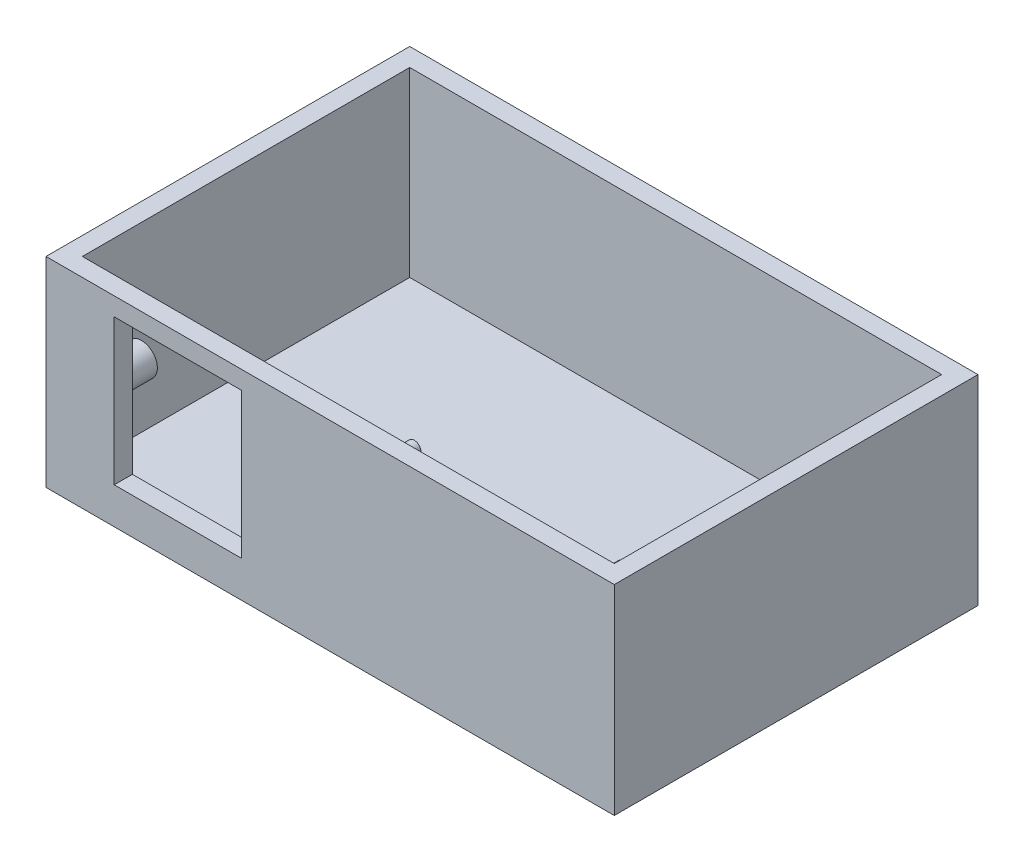
ISO-10303-21;
HEADER;
FILE_DESCRIPTION(('STEP AP214'),'2;1');
FILE_NAME('part.step','',(''),(''),'','','');
FILE_SCHEMA(('AUTOMOTIVE_DESIGN { 1 0 10303 214 1 1 1 1 }'));
ENDSEC;
DATA;
#1=APPLICATION_CONTEXT('core data for automotive mechanical design processes');
#2=APPLICATION_PROTOCOL_DEFINITION('international standard','automotive_design',2000,#1);
#3=PRODUCT_CONTEXT('',#1,'mechanical');
#4=PRODUCT('Part','Part','',(#3));
#5=PRODUCT_RELATED_PRODUCT_CATEGORY('part','',(#4));
#6=PRODUCT_DEFINITION_FORMATION('','',#4);
#7=PRODUCT_DEFINITION_CONTEXT('part definition',#1,'design');
#8=PRODUCT_DEFINITION('design','',#6,#7);
#9=PRODUCT_DEFINITION_SHAPE('','',#8);
#10=(LENGTH_UNIT() NAMED_UNIT(*) SI_UNIT(.MILLI.,.METRE.));
#11=(NAMED_UNIT(*) PLANE_ANGLE_UNIT() SI_UNIT($,.RADIAN.));
#12=(NAMED_UNIT(*) SI_UNIT($,.STERADIAN.) SOLID_ANGLE_UNIT());
#13=UNCERTAINTY_MEASURE_WITH_UNIT(LENGTH_MEASURE(1.E-05),#10,'distance_accuracy_value','');
#14=(GEOMETRIC_REPRESENTATION_CONTEXT(3) GLOBAL_UNCERTAINTY_ASSIGNED_CONTEXT((#13)) GLOBAL_UNIT_ASSIGNED_CONTEXT((#10,
#11,#12)) REPRESENTATION_CONTEXT('',''));
#15=CARTESIAN_POINT('',(0.,0.,0.));
#16=DIRECTION('',(0.,0.,1.));
#17=DIRECTION('',(1.,0.,0.));
#18=AXIS2_PLACEMENT_3D('',#15,#16,#17);
#19=CARTESIAN_POINT('',(0.,4.,0.));
#20=DIRECTION('',(1.,0.,0.));
#21=DIRECTION('',(0.,0.,-1.));
#22=AXIS2_PLACEMENT_3D('',#19,#20,#21);
#23=PLANE('',#22);
#24=DIRECTION('',(0.,0.,1.));
#25=VECTOR('',#24,1.);
#26=CARTESIAN_POINT('',(0.,0.,0.));
#27=LINE('',#26,#25);
#28=CARTESIAN_POINT('',(0.,0.,-80.));
#29=VERTEX_POINT('',#28);
#30=CARTESIAN_POINT('',(0.,0.,0.));
#31=VERTEX_POINT('',#30);
#32=EDGE_CURVE('E288',#29,#31,#27,.T.);
#33=ORIENTED_EDGE('',*,*,#32,.T.);
#34=DIRECTION('',(0.,-1.,0.));
#35=VECTOR('',#34,1.);
#36=CARTESIAN_POINT('',(0.,4.,0.));
#37=LINE('',#36,#35);
#38=CARTESIAN_POINT('',(0.,44.,0.));
#39=VERTEX_POINT('',#38);
#40=EDGE_CURVE('E306',#39,#31,#37,.T.);
#41=ORIENTED_EDGE('',*,*,#40,.F.);
#42=DIRECTION('',(0.,0.,1.));
#43=VECTOR('',#42,1.);
#44=CARTESIAN_POINT('',(0.,44.,-80.));
#45=LINE('',#44,#43);
#46=CARTESIAN_POINT('',(0.,44.,-80.));
#47=VERTEX_POINT('',#46);
#48=EDGE_CURVE('E276',#47,#39,#45,.T.);
#49=ORIENTED_EDGE('',*,*,#48,.F.);
#50=DIRECTION('',(0.,-1.,0.));
#51=VECTOR('',#50,1.);
#52=CARTESIAN_POINT('',(0.,4.,-80.));
#53=LINE('',#52,#51);
#54=EDGE_CURVE('E297',#47,#29,#53,.T.);
#55=ORIENTED_EDGE('',*,*,#54,.T.);
#56=EDGE_LOOP('',(#33,#41,#49,#55));
#57=FACE_BOUND('',#56,.T.);
#58=ADVANCED_FACE('F45',(#57),#23,.F.);
#59=CARTESIAN_POINT('',(0.,4.,0.));
#60=DIRECTION('',(0.,0.,-1.));
#61=DIRECTION('',(-1.,0.,0.));
#62=AXIS2_PLACEMENT_3D('',#59,#60,#61);
#63=PLANE('',#62);
#64=DIRECTION('',(1.,0.,0.));
#65=VECTOR('',#64,1.);
#66=CARTESIAN_POINT('',(15.,7.99999999999999,0.));
#67=LINE('',#66,#65);
#68=CARTESIAN_POINT('',(15.,7.99999999999999,0.));
#69=VERTEX_POINT('',#68);
#70=CARTESIAN_POINT('',(43.,7.99999999999999,0.));
#71=VERTEX_POINT('',#70);
#72=EDGE_CURVE('E231',#69,#71,#67,.T.);
#73=ORIENTED_EDGE('',*,*,#72,.F.);
#74=DIRECTION('',(0.,-1.,0.));
#75=VECTOR('',#74,1.);
#76=CARTESIAN_POINT('',(15.,7.99999999999999,0.));
#77=LINE('',#76,#75);
#78=CARTESIAN_POINT('',(15.,40.,0.));
#79=VERTEX_POINT('',#78);
#80=EDGE_CURVE('E59',#79,#69,#77,.T.);
#81=ORIENTED_EDGE('',*,*,#80,.F.);
#82=DIRECTION('',(-1.,0.,0.));
#83=VECTOR('',#82,1.);
#84=CARTESIAN_POINT('',(15.,40.,0.));
#85=LINE('',#84,#83);
#86=CARTESIAN_POINT('',(43.,40.,0.));
#87=VERTEX_POINT('',#86);
#88=EDGE_CURVE('E236',#87,#79,#85,.T.);
#89=ORIENTED_EDGE('',*,*,#88,.F.);
#90=DIRECTION('',(0.,1.,0.));
#91=VECTOR('',#90,1.);
#92=CARTESIAN_POINT('',(43.,7.99999999999999,0.));
#93=LINE('',#92,#91);
#94=EDGE_CURVE('E233',#71,#87,#93,.T.);
#95=ORIENTED_EDGE('',*,*,#94,.F.);
#96=EDGE_LOOP('',(#73,#81,#89,#95));
#97=FACE_BOUND('',#96,.T.);
#98=DIRECTION('',(1.,0.,0.));
#99=VECTOR('',#98,1.);
#100=CARTESIAN_POINT('',(0.,0.,0.));
#101=LINE('',#100,#99);
#102=CARTESIAN_POINT('',(125.,0.,0.));
#103=VERTEX_POINT('',#102);
#104=EDGE_CURVE('E291',#31,#103,#101,.T.);
#105=ORIENTED_EDGE('',*,*,#104,.T.);
#106=DIRECTION('',(0.,-1.,0.));
#107=VECTOR('',#106,1.);
#108=CARTESIAN_POINT('',(125.,4.,0.));
#109=LINE('',#108,#107);
#110=CARTESIAN_POINT('',(125.,44.,0.));
#111=VERTEX_POINT('',#110);
#112=EDGE_CURVE('E303',#111,#103,#109,.T.);
#113=ORIENTED_EDGE('',*,*,#112,.F.);
#114=DIRECTION('',(1.,0.,0.));
#115=VECTOR('',#114,1.);
#116=CARTESIAN_POINT('',(0.,44.,0.));
#117=LINE('',#116,#115);
#118=EDGE_CURVE('E279',#39,#111,#117,.T.);
#119=ORIENTED_EDGE('',*,*,#118,.F.);
#120=ORIENTED_EDGE('',*,*,#40,.T.);
#121=EDGE_LOOP('',(#105,#113,#119,#120));
#122=FACE_BOUND('',#121,.T.);
#123=ADVANCED_FACE('F331',(#97,#122),#63,.F.);
#124=CARTESIAN_POINT('',(125.,4.,0.));
#125=DIRECTION('',(-1.,0.,0.));
#126=DIRECTION('',(0.,0.,1.));
#127=AXIS2_PLACEMENT_3D('',#124,#125,#126);
#128=PLANE('',#127);
#129=DIRECTION('',(0.,0.,-1.));
#130=VECTOR('',#129,1.);
#131=CARTESIAN_POINT('',(125.,0.,0.));
#132=LINE('',#131,#130);
#133=CARTESIAN_POINT('',(125.,0.,-80.));
#134=VERTEX_POINT('',#133);
#135=EDGE_CURVE('E293',#103,#134,#132,.T.);
#136=ORIENTED_EDGE('',*,*,#135,.T.);
#137=DIRECTION('',(0.,-1.,0.));
#138=VECTOR('',#137,1.);
#139=CARTESIAN_POINT('',(125.,4.,-80.));
#140=LINE('',#139,#138);
#141=CARTESIAN_POINT('',(125.,44.,-80.));
#142=VERTEX_POINT('',#141);
#143=EDGE_CURVE('E300',#142,#134,#140,.T.);
#144=ORIENTED_EDGE('',*,*,#143,.F.);
#145=DIRECTION('',(0.,0.,-1.));
#146=VECTOR('',#145,1.);
#147=CARTESIAN_POINT('',(125.,44.,-80.));
#148=LINE('',#147,#146);
#149=EDGE_CURVE('E282',#111,#142,#148,.T.);
#150=ORIENTED_EDGE('',*,*,#149,.F.);
#151=ORIENTED_EDGE('',*,*,#112,.T.);
#152=EDGE_LOOP('',(#136,#144,#150,#151));
#153=FACE_BOUND('',#152,.T.);
#154=ADVANCED_FACE('F334',(#153),#128,.F.);
#155=CARTESIAN_POINT('',(0.,4.,-80.));
#156=DIRECTION('',(0.,0.,1.));
#157=DIRECTION('',(1.,0.,0.));
#158=AXIS2_PLACEMENT_3D('',#155,#156,#157);
#159=PLANE('',#158);
#160=DIRECTION('',(-1.,0.,0.));
#161=VECTOR('',#160,1.);
#162=CARTESIAN_POINT('',(0.,0.,-80.));
#163=LINE('',#162,#161);
#164=EDGE_CURVE('E295',#134,#29,#163,.T.);
#165=ORIENTED_EDGE('',*,*,#164,.T.);
#166=ORIENTED_EDGE('',*,*,#54,.F.);
#167=DIRECTION('',(-1.,0.,0.));
#168=VECTOR('',#167,1.);
#169=CARTESIAN_POINT('',(0.,44.,-80.));
#170=LINE('',#169,#168);
#171=EDGE_CURVE('E285',#142,#47,#170,.T.);
#172=ORIENTED_EDGE('',*,*,#171,.F.);
#173=ORIENTED_EDGE('',*,*,#143,.T.);
#174=EDGE_LOOP('',(#165,#166,#172,#173));
#175=FACE_BOUND('',#174,.T.);
#176=ADVANCED_FACE('F344',(#175),#159,.F.);
#177=CARTESIAN_POINT('',(0.,0.,0.));
#178=DIRECTION('',(0.,-1.,0.));
#179=DIRECTION('',(0.,0.,-1.));
#180=AXIS2_PLACEMENT_3D('',#177,#178,#179);
#181=PLANE('',#180);
#182=ORIENTED_EDGE('',*,*,#32,.F.);
#183=ORIENTED_EDGE('',*,*,#164,.F.);
#184=ORIENTED_EDGE('',*,*,#135,.F.);
#185=ORIENTED_EDGE('',*,*,#104,.F.);
#186=EDGE_LOOP('',(#182,#183,#184,#185));
#187=FACE_BOUND('',#186,.T.);
#188=ADVANCED_FACE('F342',(#187),#181,.T.);
#189=CARTESIAN_POINT('',(0.,44.,0.));
#190=DIRECTION('',(0.,1.,0.));
#191=DIRECTION('',(0.,0.,1.));
#192=AXIS2_PLACEMENT_3D('',#189,#190,#191);
#193=PLANE('',#192);
#194=ORIENTED_EDGE('',*,*,#48,.T.);
#195=ORIENTED_EDGE('',*,*,#118,.T.);
#196=ORIENTED_EDGE('',*,*,#149,.T.);
#197=ORIENTED_EDGE('',*,*,#171,.T.);
#198=EDGE_LOOP('',(#194,#195,#196,#197));
#199=FACE_BOUND('',#198,.T.);
#200=DIRECTION('',(1.,0.,0.));
#201=VECTOR('',#200,1.);
#202=CARTESIAN_POINT('',(4.,44.,-4.));
#203=LINE('',#202,#201);
#204=CARTESIAN_POINT('',(4.,44.,-4.));
#205=VERTEX_POINT('',#204);
#206=CARTESIAN_POINT('',(121.,44.,-4.));
#207=VERTEX_POINT('',#206);
#208=EDGE_CURVE('E249',#205,#207,#203,.T.);
#209=ORIENTED_EDGE('',*,*,#208,.F.);
#210=DIRECTION('',(0.,0.,1.));
#211=VECTOR('',#210,1.);
#212=CARTESIAN_POINT('',(4.,44.,-76.));
#213=LINE('',#212,#211);
#214=CARTESIAN_POINT('',(4.,44.,-76.));
#215=VERTEX_POINT('',#214);
#216=EDGE_CURVE('E247',#215,#205,#213,.T.);
#217=ORIENTED_EDGE('',*,*,#216,.F.);
#218=DIRECTION('',(-1.,0.,0.));
#219=VECTOR('',#218,1.);
#220=CARTESIAN_POINT('',(4.,44.,-76.));
#221=LINE('',#220,#219);
#222=CARTESIAN_POINT('',(121.,44.,-76.));
#223=VERTEX_POINT('',#222);
#224=EDGE_CURVE('E255',#223,#215,#221,.T.);
#225=ORIENTED_EDGE('',*,*,#224,.F.);
#226=DIRECTION('',(0.,0.,-1.));
#227=VECTOR('',#226,1.);
#228=CARTESIAN_POINT('',(121.,44.,-76.));
#229=LINE('',#228,#227);
#230=EDGE_CURVE('E252',#207,#223,#229,.T.);
#231=ORIENTED_EDGE('',*,*,#230,.F.);
#232=EDGE_LOOP('',(#209,#217,#225,#231));
#233=FACE_BOUND('',#232,.T.);
#234=ADVANCED_FACE('F349',(#199,#233),#193,.T.);
#235=CARTESIAN_POINT('',(4.,44.,-76.));
#236=DIRECTION('',(1.,0.,0.));
#237=DIRECTION('',(0.,0.,-1.));
#238=AXIS2_PLACEMENT_3D('',#235,#236,#237);
#239=PLANE('',#238);
#240=DIRECTION('',(0.,0.,1.));
#241=VECTOR('',#240,1.);
#242=CARTESIAN_POINT('',(4.,4.,-76.));
#243=LINE('',#242,#241);
#244=CARTESIAN_POINT('',(4.,4.,-76.));
#245=VERTEX_POINT('',#244);
#246=CARTESIAN_POINT('',(4.,4.,-4.));
#247=VERTEX_POINT('',#246);
#248=EDGE_CURVE('E242',#245,#247,#243,.T.);
#249=ORIENTED_EDGE('',*,*,#248,.F.);
#250=DIRECTION('',(0.,-1.,0.));
#251=VECTOR('',#250,1.);
#252=CARTESIAN_POINT('',(4.,44.,-76.));
#253=LINE('',#252,#251);
#254=EDGE_CURVE('E257',#215,#245,#253,.T.);
#255=ORIENTED_EDGE('',*,*,#254,.F.);
#256=ORIENTED_EDGE('',*,*,#216,.T.);
#257=DIRECTION('',(0.,-1.,0.));
#258=VECTOR('',#257,1.);
#259=CARTESIAN_POINT('',(4.,44.,-4.));
#260=LINE('',#259,#258);
#261=EDGE_CURVE('E273',#205,#247,#260,.T.);
#262=ORIENTED_EDGE('',*,*,#261,.T.);
#263=EDGE_LOOP('',(#249,#255,#256,#262));
#264=FACE_BOUND('',#263,.T.);
#265=ADVANCED_FACE('F352',(#264),#239,.T.);
#266=CARTESIAN_POINT('',(4.,44.,-4.));
#267=DIRECTION('',(0.,0.,-1.));
#268=DIRECTION('',(-1.,0.,0.));
#269=AXIS2_PLACEMENT_3D('',#266,#267,#268);
#270=PLANE('',#269);
#271=CARTESIAN_POINT('',(70.,14.,-4.));
#272=DIRECTION('',(0.,0.,-1.));
#273=DIRECTION('',(-1.,0.,0.));
#274=AXIS2_PLACEMENT_3D('',#271,#272,#273);
#275=CIRCLE('',#274,1.5);
#276=CARTESIAN_POINT('',(68.5,14.,-4.));
#277=VERTEX_POINT('',#276);
#278=EDGE_CURVE('E195',#277,#277,#275,.T.);
#279=ORIENTED_EDGE('',*,*,#278,.F.);
#280=EDGE_LOOP('',(#279));
#281=FACE_BOUND('',#280,.T.);
#282=CARTESIAN_POINT('',(116.,13.5,-4.));
#283=DIRECTION('',(0.,0.,-1.));
#284=DIRECTION('',(-1.,0.,0.));
#285=AXIS2_PLACEMENT_3D('',#282,#283,#284);
#286=CIRCLE('',#285,1.5);
#287=CARTESIAN_POINT('',(114.5,13.5,-4.));
#288=VERTEX_POINT('',#287);
#289=EDGE_CURVE('E201',#288,#288,#286,.T.);
#290=ORIENTED_EDGE('',*,*,#289,.F.);
#291=EDGE_LOOP('',(#290));
#292=FACE_BOUND('',#291,.T.);
#293=CARTESIAN_POINT('',(70.,37.,-4.));
#294=DIRECTION('',(0.,0.,-1.));
#295=DIRECTION('',(-1.,0.,0.));
#296=AXIS2_PLACEMENT_3D('',#293,#294,#295);
#297=CIRCLE('',#296,1.5);
#298=CARTESIAN_POINT('',(68.5,37.,-4.));
#299=VERTEX_POINT('',#298);
#300=EDGE_CURVE('E207',#299,#299,#297,.T.);
#301=ORIENTED_EDGE('',*,*,#300,.F.);
#302=EDGE_LOOP('',(#301));
#303=FACE_BOUND('',#302,.T.);
#304=CARTESIAN_POINT('',(116.,37.,-4.));
#305=DIRECTION('',(0.,0.,-1.));
#306=DIRECTION('',(-1.,0.,0.));
#307=AXIS2_PLACEMENT_3D('',#304,#305,#306);
#308=CIRCLE('',#307,1.5);
#309=CARTESIAN_POINT('',(114.5,37.,-4.));
#310=VERTEX_POINT('',#309);
#311=EDGE_CURVE('E213',#310,#310,#308,.T.);
#312=ORIENTED_EDGE('',*,*,#311,.F.);
#313=EDGE_LOOP('',(#312));
#314=FACE_BOUND('',#313,.T.);
#315=CARTESIAN_POINT('',(10.,24.,-4.));
#316=DIRECTION('',(0.,0.,-1.));
#317=DIRECTION('',(-1.,0.,0.));
#318=AXIS2_PLACEMENT_3D('',#315,#316,#317);
#319=CIRCLE('',#318,3.5);
#320=CARTESIAN_POINT('',(6.5,24.,-4.));
#321=VERTEX_POINT('',#320);
#322=EDGE_CURVE('E219',#321,#321,#319,.T.);
#323=ORIENTED_EDGE('',*,*,#322,.F.);
#324=EDGE_LOOP('',(#323));
#325=FACE_BOUND('',#324,.T.);
#326=CARTESIAN_POINT('',(48.,24.,-4.));
#327=DIRECTION('',(0.,0.,-1.));
#328=DIRECTION('',(-1.,0.,0.));
#329=AXIS2_PLACEMENT_3D('',#326,#327,#328);
#330=CIRCLE('',#329,3.5);
#331=CARTESIAN_POINT('',(44.5,24.,-4.));
#332=VERTEX_POINT('',#331);
#333=EDGE_CURVE('E222',#332,#332,#330,.T.);
#334=ORIENTED_EDGE('',*,*,#333,.F.);
#335=EDGE_LOOP('',(#334));
#336=FACE_BOUND('',#335,.T.);
#337=DIRECTION('',(0.,1.,0.));
#338=VECTOR('',#337,1.);
#339=CARTESIAN_POINT('',(15.,44.,-4.));
#340=LINE('',#339,#338);
#341=CARTESIAN_POINT('',(15.,7.99999999999999,-4.));
#342=VERTEX_POINT('',#341);
#343=CARTESIAN_POINT('',(15.,40.,-4.));
#344=VERTEX_POINT('',#343);
#345=EDGE_CURVE('E11',#342,#344,#340,.T.);
#346=ORIENTED_EDGE('',*,*,#345,.F.);
#347=DIRECTION('',(-1.,0.,0.));
#348=VECTOR('',#347,1.);
#349=CARTESIAN_POINT('',(4.,7.99999999999999,-4.));
#350=LINE('',#349,#348);
#351=CARTESIAN_POINT('',(43.,7.99999999999999,-4.));
#352=VERTEX_POINT('',#351);
#353=EDGE_CURVE('E309',#352,#342,#350,.T.);
#354=ORIENTED_EDGE('',*,*,#353,.F.);
#355=DIRECTION('',(0.,-1.,0.));
#356=VECTOR('',#355,1.);
#357=CARTESIAN_POINT('',(43.,44.,-4.));
#358=LINE('',#357,#356);
#359=CARTESIAN_POINT('',(43.,40.,-4.));
#360=VERTEX_POINT('',#359);
#361=EDGE_CURVE('E311',#360,#352,#358,.T.);
#362=ORIENTED_EDGE('',*,*,#361,.F.);
#363=DIRECTION('',(1.,0.,0.));
#364=VECTOR('',#363,1.);
#365=CARTESIAN_POINT('',(4.,40.,-4.));
#366=LINE('',#365,#364);
#367=EDGE_CURVE('E52',#344,#360,#366,.T.);
#368=ORIENTED_EDGE('',*,*,#367,.F.);
#369=EDGE_LOOP('',(#346,#354,#362,#368));
#370=FACE_BOUND('',#369,.T.);
#371=DIRECTION('',(1.,0.,0.));
#372=VECTOR('',#371,1.);
#373=CARTESIAN_POINT('',(4.,4.,-4.));
#374=LINE('',#373,#372);
#375=CARTESIAN_POINT('',(121.,4.,-4.));
#376=VERTEX_POINT('',#375);
#377=EDGE_CURVE('E260',#247,#376,#374,.T.);
#378=ORIENTED_EDGE('',*,*,#377,.F.);
#379=ORIENTED_EDGE('',*,*,#261,.F.);
#380=ORIENTED_EDGE('',*,*,#208,.T.);
#381=DIRECTION('',(0.,-1.,0.));
#382=VECTOR('',#381,1.);
#383=CARTESIAN_POINT('',(121.,44.,-4.));
#384=LINE('',#383,#382);
#385=EDGE_CURVE('E271',#207,#376,#384,.T.);
#386=ORIENTED_EDGE('',*,*,#385,.T.);
#387=EDGE_LOOP('',(#378,#379,#380,#386));
#388=FACE_BOUND('',#387,.T.);
#389=ADVANCED_FACE('F325',(#281,#292,#303,#314,#325,#336,#370,#388),#270,.T.);
#390=CARTESIAN_POINT('',(121.,44.,-76.));
#391=DIRECTION('',(-1.,0.,0.));
#392=DIRECTION('',(0.,0.,1.));
#393=AXIS2_PLACEMENT_3D('',#390,#391,#392);
#394=PLANE('',#393);
#395=DIRECTION('',(0.,0.,-1.));
#396=VECTOR('',#395,1.);
#397=CARTESIAN_POINT('',(121.,4.,-76.));
#398=LINE('',#397,#396);
#399=CARTESIAN_POINT('',(121.,4.,-76.));
#400=VERTEX_POINT('',#399);
#401=EDGE_CURVE('E263',#376,#400,#398,.T.);
#402=ORIENTED_EDGE('',*,*,#401,.F.);
#403=ORIENTED_EDGE('',*,*,#385,.F.);
#404=ORIENTED_EDGE('',*,*,#230,.T.);
#405=DIRECTION('',(0.,-1.,0.));
#406=VECTOR('',#405,1.);
#407=CARTESIAN_POINT('',(121.,44.,-76.));
#408=LINE('',#407,#406);
#409=EDGE_CURVE('E269',#223,#400,#408,.T.);
#410=ORIENTED_EDGE('',*,*,#409,.T.);
#411=EDGE_LOOP('',(#402,#403,#404,#410));
#412=FACE_BOUND('',#411,.T.);
#413=ADVANCED_FACE('F362',(#412),#394,.T.);
#414=CARTESIAN_POINT('',(4.,44.,-76.));
#415=DIRECTION('',(0.,0.,1.));
#416=DIRECTION('',(1.,0.,0.));
#417=AXIS2_PLACEMENT_3D('',#414,#415,#416);
#418=PLANE('',#417);
#419=DIRECTION('',(-1.,0.,0.));
#420=VECTOR('',#419,1.);
#421=CARTESIAN_POINT('',(4.,4.,-76.));
#422=LINE('',#421,#420);
#423=EDGE_CURVE('E250',#400,#245,#422,.T.);
#424=ORIENTED_EDGE('',*,*,#423,.F.);
#425=ORIENTED_EDGE('',*,*,#409,.F.);
#426=ORIENTED_EDGE('',*,*,#224,.T.);
#427=ORIENTED_EDGE('',*,*,#254,.T.);
#428=EDGE_LOOP('',(#424,#425,#426,#427));
#429=FACE_BOUND('',#428,.T.);
#430=ADVANCED_FACE('F370',(#429),#418,.T.);
#431=CARTESIAN_POINT('',(0.,4.,0.));
#432=DIRECTION('',(0.,-1.,0.));
#433=DIRECTION('',(0.,0.,-1.));
#434=AXIS2_PLACEMENT_3D('',#431,#432,#433);
#435=PLANE('',#434);
#436=ORIENTED_EDGE('',*,*,#423,.T.);
#437=ORIENTED_EDGE('',*,*,#248,.T.);
#438=ORIENTED_EDGE('',*,*,#377,.T.);
#439=ORIENTED_EDGE('',*,*,#401,.T.);
#440=EDGE_LOOP('',(#436,#437,#438,#439));
#441=FACE_BOUND('',#440,.T.);
#442=ADVANCED_FACE('F365',(#441),#435,.F.);
#443=CARTESIAN_POINT('',(15.,7.99999999999999,-7.));
#444=DIRECTION('',(-1.,0.,0.));
#445=DIRECTION('',(0.,0.,1.));
#446=AXIS2_PLACEMENT_3D('',#443,#444,#445);
#447=PLANE('',#446);
#448=ORIENTED_EDGE('',*,*,#345,.T.);
#449=DIRECTION('',(0.,0.,1.));
#450=VECTOR('',#449,1.);
#451=CARTESIAN_POINT('',(15.,40.,-7.));
#452=LINE('',#451,#450);
#453=EDGE_CURVE('E240',#344,#79,#452,.T.);
#454=ORIENTED_EDGE('',*,*,#453,.T.);
#455=ORIENTED_EDGE('',*,*,#80,.T.);
#456=DIRECTION('',(0.,0.,1.));
#457=VECTOR('',#456,1.);
#458=CARTESIAN_POINT('',(15.,7.99999999999999,-7.));
#459=LINE('',#458,#457);
#460=EDGE_CURVE('E239',#342,#69,#459,.T.);
#461=ORIENTED_EDGE('',*,*,#460,.F.);
#462=EDGE_LOOP('',(#448,#454,#455,#461));
#463=FACE_BOUND('',#462,.T.);
#464=ADVANCED_FACE('F329',(#463),#447,.F.);
#465=CARTESIAN_POINT('',(15.,40.,-7.));
#466=DIRECTION('',(0.,1.,0.));
#467=DIRECTION('',(0.,0.,1.));
#468=AXIS2_PLACEMENT_3D('',#465,#466,#467);
#469=PLANE('',#468);
#470=ORIENTED_EDGE('',*,*,#367,.T.);
#471=DIRECTION('',(0.,0.,1.));
#472=VECTOR('',#471,1.);
#473=CARTESIAN_POINT('',(43.,40.,-7.));
#474=LINE('',#473,#472);
#475=EDGE_CURVE('E243',#360,#87,#474,.T.);
#476=ORIENTED_EDGE('',*,*,#475,.T.);
#477=ORIENTED_EDGE('',*,*,#88,.T.);
#478=ORIENTED_EDGE('',*,*,#453,.F.);
#479=EDGE_LOOP('',(#470,#476,#477,#478));
#480=FACE_BOUND('',#479,.T.);
#481=ADVANCED_FACE('F316',(#480),#469,.F.);
#482=CARTESIAN_POINT('',(43.,7.99999999999999,-7.));
#483=DIRECTION('',(1.,0.,0.));
#484=DIRECTION('',(0.,0.,-1.));
#485=AXIS2_PLACEMENT_3D('',#482,#483,#484);
#486=PLANE('',#485);
#487=ORIENTED_EDGE('',*,*,#361,.T.);
#488=DIRECTION('',(0.,0.,1.));
#489=VECTOR('',#488,1.);
#490=CARTESIAN_POINT('',(43.,7.99999999999999,-7.));
#491=LINE('',#490,#489);
#492=EDGE_CURVE('E67',#352,#71,#491,.T.);
#493=ORIENTED_EDGE('',*,*,#492,.T.);
#494=ORIENTED_EDGE('',*,*,#94,.T.);
#495=ORIENTED_EDGE('',*,*,#475,.F.);
#496=EDGE_LOOP('',(#487,#493,#494,#495));
#497=FACE_BOUND('',#496,.T.);
#498=ADVANCED_FACE('F321',(#497),#486,.F.);
#499=CARTESIAN_POINT('',(15.,7.99999999999999,-7.));
#500=DIRECTION('',(0.,-1.,0.));
#501=DIRECTION('',(0.,0.,-1.));
#502=AXIS2_PLACEMENT_3D('',#499,#500,#501);
#503=PLANE('',#502);
#504=ORIENTED_EDGE('',*,*,#353,.T.);
#505=ORIENTED_EDGE('',*,*,#460,.T.);
#506=ORIENTED_EDGE('',*,*,#72,.T.);
#507=ORIENTED_EDGE('',*,*,#492,.F.);
#508=EDGE_LOOP('',(#504,#505,#506,#507));
#509=FACE_BOUND('',#508,.T.);
#510=ADVANCED_FACE('F327',(#509),#503,.F.);
#511=CARTESIAN_POINT('',(48.,24.,-11.));
#512=DIRECTION('',(0.,0.,1.));
#513=DIRECTION('',(1.,0.,0.));
#514=AXIS2_PLACEMENT_3D('',#511,#512,#513);
#515=CYLINDRICAL_SURFACE('',#514,3.5);
#516=CARTESIAN_POINT('',(48.,24.,-11.));
#517=DIRECTION('',(0.,0.,-1.));
#518=DIRECTION('',(-1.,0.,0.));
#519=AXIS2_PLACEMENT_3D('',#516,#517,#518);
#520=CIRCLE('',#519,3.5);
#521=CARTESIAN_POINT('',(44.5,24.,-11.));
#522=VERTEX_POINT('',#521);
#523=EDGE_CURVE('E225',#522,#522,#520,.T.);
#524=ORIENTED_EDGE('',*,*,#523,.F.);
#525=EDGE_LOOP('',(#524));
#526=FACE_BOUND('',#525,.T.);
#527=ORIENTED_EDGE('',*,*,#333,.T.);
#528=EDGE_LOOP('',(#527));
#529=FACE_BOUND('',#528,.T.);
#530=ADVANCED_FACE('F478',(#526,#529),#515,.T.);
#531=CARTESIAN_POINT('',(48.,24.,-11.));
#532=DIRECTION('',(0.,0.,-1.));
#533=DIRECTION('',(-1.,0.,0.));
#534=AXIS2_PLACEMENT_3D('',#531,#532,#533);
#535=PLANE('',#534);
#536=CARTESIAN_POINT('',(48.,24.,-11.));
#537=DIRECTION('',(0.,0.,-1.));
#538=DIRECTION('',(-1.,0.,0.));
#539=AXIS2_PLACEMENT_3D('',#536,#537,#538);
#540=CIRCLE('',#539,0.474999999999989);
#541=CARTESIAN_POINT('',(47.525,24.,-11.));
#542=VERTEX_POINT('',#541);
#543=EDGE_CURVE('E160',#542,#542,#540,.T.);
#544=ORIENTED_EDGE('',*,*,#543,.F.);
#545=EDGE_LOOP('',(#544));
#546=FACE_BOUND('',#545,.T.);
#547=ORIENTED_EDGE('',*,*,#523,.T.);
#548=EDGE_LOOP('',(#547));
#549=FACE_BOUND('',#548,.T.);
#550=ADVANCED_FACE('F493',(#546,#549),#535,.T.);
#551=CARTESIAN_POINT('',(10.,24.,-11.));
#552=DIRECTION('',(0.,0.,1.));
#553=DIRECTION('',(1.,0.,0.));
#554=AXIS2_PLACEMENT_3D('',#551,#552,#553);
#555=CYLINDRICAL_SURFACE('',#554,3.5);
#556=CARTESIAN_POINT('',(10.,24.,-11.));
#557=DIRECTION('',(0.,0.,-1.));
#558=DIRECTION('',(-1.,0.,0.));
#559=AXIS2_PLACEMENT_3D('',#556,#557,#558);
#560=CIRCLE('',#559,3.5);
#561=CARTESIAN_POINT('',(6.5,24.,-11.));
#562=VERTEX_POINT('',#561);
#563=EDGE_CURVE('E216',#562,#562,#560,.T.);
#564=ORIENTED_EDGE('',*,*,#563,.F.);
#565=EDGE_LOOP('',(#564));
#566=FACE_BOUND('',#565,.T.);
#567=ORIENTED_EDGE('',*,*,#322,.T.);
#568=EDGE_LOOP('',(#567));
#569=FACE_BOUND('',#568,.T.);
#570=ADVANCED_FACE('F502',(#566,#569),#555,.T.);
#571=CARTESIAN_POINT('',(10.,24.,-11.));
#572=DIRECTION('',(0.,0.,-1.));
#573=DIRECTION('',(-1.,0.,0.));
#574=AXIS2_PLACEMENT_3D('',#571,#572,#573);
#575=PLANE('',#574);
#576=CARTESIAN_POINT('',(10.,24.,-11.));
#577=DIRECTION('',(0.,0.,-1.));
#578=DIRECTION('',(-1.,0.,0.));
#579=AXIS2_PLACEMENT_3D('',#576,#577,#578);
#580=CIRCLE('',#579,0.474999999999989);
#581=CARTESIAN_POINT('',(9.52500000000001,24.,-11.));
#582=VERTEX_POINT('',#581);
#583=EDGE_CURVE('E159',#582,#582,#580,.T.);
#584=ORIENTED_EDGE('',*,*,#583,.F.);
#585=EDGE_LOOP('',(#584));
#586=FACE_BOUND('',#585,.T.);
#587=ORIENTED_EDGE('',*,*,#563,.T.);
#588=EDGE_LOOP('',(#587));
#589=FACE_BOUND('',#588,.T.);
#590=ADVANCED_FACE('F507',(#586,#589),#575,.T.);
#591=CARTESIAN_POINT('',(116.,37.,-11.));
#592=DIRECTION('',(0.,0.,1.));
#593=DIRECTION('',(1.,0.,0.));
#594=AXIS2_PLACEMENT_3D('',#591,#592,#593);
#595=CYLINDRICAL_SURFACE('',#594,1.5);
#596=CARTESIAN_POINT('',(116.,37.,-11.));
#597=DIRECTION('',(0.,0.,-1.));
#598=DIRECTION('',(-1.,0.,0.));
#599=AXIS2_PLACEMENT_3D('',#596,#597,#598);
#600=CIRCLE('',#599,1.5);
#601=CARTESIAN_POINT('',(114.5,37.,-11.));
#602=VERTEX_POINT('',#601);
#603=EDGE_CURVE('E210',#602,#602,#600,.T.);
#604=ORIENTED_EDGE('',*,*,#603,.F.);
#605=EDGE_LOOP('',(#604));
#606=FACE_BOUND('',#605,.T.);
#607=ORIENTED_EDGE('',*,*,#311,.T.);
#608=EDGE_LOOP('',(#607));
#609=FACE_BOUND('',#608,.T.);
#610=ADVANCED_FACE('F516',(#606,#609),#595,.T.);
#611=CARTESIAN_POINT('',(116.,37.,-11.));
#612=DIRECTION('',(0.,0.,-1.));
#613=DIRECTION('',(-1.,0.,0.));
#614=AXIS2_PLACEMENT_3D('',#611,#612,#613);
#615=PLANE('',#614);
#616=CARTESIAN_POINT('',(116.,37.,-11.));
#617=DIRECTION('',(0.,0.,-1.));
#618=DIRECTION('',(-1.,0.,0.));
#619=AXIS2_PLACEMENT_3D('',#616,#617,#618);
#620=CIRCLE('',#619,0.474999999999989);
#621=CARTESIAN_POINT('',(115.525,37.,-11.));
#622=VERTEX_POINT('',#621);
#623=EDGE_CURVE('E188',#622,#622,#620,.T.);
#624=ORIENTED_EDGE('',*,*,#623,.F.);
#625=EDGE_LOOP('',(#624));
#626=FACE_BOUND('',#625,.T.);
#627=ORIENTED_EDGE('',*,*,#603,.T.);
#628=EDGE_LOOP('',(#627));
#629=FACE_BOUND('',#628,.T.);
#630=ADVANCED_FACE('F521',(#626,#629),#615,.T.);
#631=CARTESIAN_POINT('',(70.,37.,-11.));
#632=DIRECTION('',(0.,0.,1.));
#633=DIRECTION('',(1.,0.,0.));
#634=AXIS2_PLACEMENT_3D('',#631,#632,#633);
#635=CYLINDRICAL_SURFACE('',#634,1.5);
#636=CARTESIAN_POINT('',(70.,37.,-11.));
#637=DIRECTION('',(0.,0.,-1.));
#638=DIRECTION('',(-1.,0.,0.));
#639=AXIS2_PLACEMENT_3D('',#636,#637,#638);
#640=CIRCLE('',#639,1.5);
#641=CARTESIAN_POINT('',(68.5,37.,-11.));
#642=VERTEX_POINT('',#641);
#643=EDGE_CURVE('E204',#642,#642,#640,.T.);
#644=ORIENTED_EDGE('',*,*,#643,.F.);
#645=EDGE_LOOP('',(#644));
#646=FACE_BOUND('',#645,.T.);
#647=ORIENTED_EDGE('',*,*,#300,.T.);
#648=EDGE_LOOP('',(#647));
#649=FACE_BOUND('',#648,.T.);
#650=ADVANCED_FACE('F530',(#646,#649),#635,.T.);
#651=CARTESIAN_POINT('',(70.,37.,-11.));
#652=DIRECTION('',(0.,0.,-1.));
#653=DIRECTION('',(-1.,0.,0.));
#654=AXIS2_PLACEMENT_3D('',#651,#652,#653);
#655=PLANE('',#654);
#656=CARTESIAN_POINT('',(70.,37.,-11.));
#657=DIRECTION('',(0.,0.,-1.));
#658=DIRECTION('',(-1.,0.,0.));
#659=AXIS2_PLACEMENT_3D('',#656,#657,#658);
#660=CIRCLE('',#659,0.474999999999989);
#661=CARTESIAN_POINT('',(69.525,37.,-11.));
#662=VERTEX_POINT('',#661);
#663=EDGE_CURVE('E176',#662,#662,#660,.T.);
#664=ORIENTED_EDGE('',*,*,#663,.F.);
#665=EDGE_LOOP('',(#664));
#666=FACE_BOUND('',#665,.T.);
#667=ORIENTED_EDGE('',*,*,#643,.T.);
#668=EDGE_LOOP('',(#667));
#669=FACE_BOUND('',#668,.T.);
#670=ADVANCED_FACE('F535',(#666,#669),#655,.T.);
#671=CARTESIAN_POINT('',(116.,13.5,-11.));
#672=DIRECTION('',(0.,0.,1.));
#673=DIRECTION('',(1.,0.,0.));
#674=AXIS2_PLACEMENT_3D('',#671,#672,#673);
#675=CYLINDRICAL_SURFACE('',#674,1.5);
#676=CARTESIAN_POINT('',(116.,13.5,-11.));
#677=DIRECTION('',(0.,0.,-1.));
#678=DIRECTION('',(-1.,0.,0.));
#679=AXIS2_PLACEMENT_3D('',#676,#677,#678);
#680=CIRCLE('',#679,1.5);
#681=CARTESIAN_POINT('',(114.5,13.5,-11.));
#682=VERTEX_POINT('',#681);
#683=EDGE_CURVE('E198',#682,#682,#680,.T.);
#684=ORIENTED_EDGE('',*,*,#683,.F.);
#685=EDGE_LOOP('',(#684));
#686=FACE_BOUND('',#685,.T.);
#687=ORIENTED_EDGE('',*,*,#289,.T.);
#688=EDGE_LOOP('',(#687));
#689=FACE_BOUND('',#688,.T.);
#690=ADVANCED_FACE('F544',(#686,#689),#675,.T.);
#691=CARTESIAN_POINT('',(116.,13.5,-11.));
#692=DIRECTION('',(0.,0.,-1.));
#693=DIRECTION('',(-1.,0.,0.));
#694=AXIS2_PLACEMENT_3D('',#691,#692,#693);
#695=PLANE('',#694);
#696=CARTESIAN_POINT('',(116.,13.5,-11.));
#697=DIRECTION('',(0.,0.,-1.));
#698=DIRECTION('',(-1.,0.,0.));
#699=AXIS2_PLACEMENT_3D('',#696,#697,#698);
#700=CIRCLE('',#699,0.474999999999989);
#701=CARTESIAN_POINT('',(115.525,13.5,-11.));
#702=VERTEX_POINT('',#701);
#703=EDGE_CURVE('E182',#702,#702,#700,.T.);
#704=ORIENTED_EDGE('',*,*,#703,.F.);
#705=EDGE_LOOP('',(#704));
#706=FACE_BOUND('',#705,.T.);
#707=ORIENTED_EDGE('',*,*,#683,.T.);
#708=EDGE_LOOP('',(#707));
#709=FACE_BOUND('',#708,.T.);
#710=ADVANCED_FACE('F549',(#706,#709),#695,.T.);
#711=CARTESIAN_POINT('',(70.,14.,-11.));
#712=DIRECTION('',(0.,0.,1.));
#713=DIRECTION('',(1.,0.,0.));
#714=AXIS2_PLACEMENT_3D('',#711,#712,#713);
#715=CYLINDRICAL_SURFACE('',#714,1.5);
#716=CARTESIAN_POINT('',(70.,14.,-11.));
#717=DIRECTION('',(0.,0.,-1.));
#718=DIRECTION('',(-1.,0.,0.));
#719=AXIS2_PLACEMENT_3D('',#716,#717,#718);
#720=CIRCLE('',#719,1.5);
#721=CARTESIAN_POINT('',(68.5,14.,-11.));
#722=VERTEX_POINT('',#721);
#723=EDGE_CURVE('E194',#722,#722,#720,.T.);
#724=ORIENTED_EDGE('',*,*,#723,.F.);
#725=EDGE_LOOP('',(#724));
#726=FACE_BOUND('',#725,.T.);
#727=ORIENTED_EDGE('',*,*,#278,.T.);
#728=EDGE_LOOP('',(#727));
#729=FACE_BOUND('',#728,.T.);
#730=ADVANCED_FACE('F558',(#726,#729),#715,.T.);
#731=CARTESIAN_POINT('',(70.,14.,-11.));
#732=DIRECTION('',(0.,0.,-1.));
#733=DIRECTION('',(-1.,0.,0.));
#734=AXIS2_PLACEMENT_3D('',#731,#732,#733);
#735=PLANE('',#734);
#736=CARTESIAN_POINT('',(70.,14.,-11.));
#737=DIRECTION('',(0.,0.,-1.));
#738=DIRECTION('',(-1.,0.,0.));
#739=AXIS2_PLACEMENT_3D('',#736,#737,#738);
#740=CIRCLE('',#739,0.474999999999989);
#741=CARTESIAN_POINT('',(69.525,14.,-11.));
#742=VERTEX_POINT('',#741);
#743=EDGE_CURVE('E170',#742,#742,#740,.T.);
#744=ORIENTED_EDGE('',*,*,#743,.F.);
#745=EDGE_LOOP('',(#744));
#746=FACE_BOUND('',#745,.T.);
#747=ORIENTED_EDGE('',*,*,#723,.T.);
#748=EDGE_LOOP('',(#747));
#749=FACE_BOUND('',#748,.T.);
#750=ADVANCED_FACE('F563',(#746,#749),#735,.T.);
#751=CARTESIAN_POINT('',(116.,37.,-7.85));
#752=DIRECTION('',(0.,0.,-1.));
#753=DIRECTION('',(-1.,0.,0.));
#754=AXIS2_PLACEMENT_3D('',#751,#752,#753);
#755=CONICAL_SURFACE('',#754,0.475000000000003,1.02974425867666);
#756=CARTESIAN_POINT('',(116.,37.,-7.56459120596191));
#757=VERTEX_POINT('',#756);
#758=VERTEX_LOOP('',#757);
#759=FACE_BOUND('',#758,.T.);
#760=CARTESIAN_POINT('',(116.,37.,-7.85));
#761=DIRECTION('',(0.,0.,-1.));
#762=DIRECTION('',(-1.,0.,0.));
#763=AXIS2_PLACEMENT_3D('',#760,#761,#762);
#764=CIRCLE('',#763,0.475000000000003);
#765=CARTESIAN_POINT('',(115.525,37.,-7.85));
#766=VERTEX_POINT('',#765);
#767=EDGE_CURVE('E191',#766,#766,#764,.T.);
#768=ORIENTED_EDGE('',*,*,#767,.T.);
#769=EDGE_LOOP('',(#768));
#770=FACE_BOUND('',#769,.T.);
#771=ADVANCED_FACE('F624',(#759,#770),#755,.F.);
#772=CARTESIAN_POINT('',(116.,37.,-11.));
#773=DIRECTION('',(0.,0.,-1.));
#774=DIRECTION('',(-1.,0.,0.));
#775=AXIS2_PLACEMENT_3D('',#772,#773,#774);
#776=CYLINDRICAL_SURFACE('',#775,0.474999999999996);
#777=ORIENTED_EDGE('',*,*,#767,.F.);
#778=EDGE_LOOP('',(#777));
#779=FACE_BOUND('',#778,.T.);
#780=ORIENTED_EDGE('',*,*,#623,.T.);
#781=EDGE_LOOP('',(#780));
#782=FACE_BOUND('',#781,.T.);
#783=ADVANCED_FACE('F637',(#779,#782),#776,.F.);
#784=CARTESIAN_POINT('',(116.,13.5,-7.85));
#785=DIRECTION('',(0.,0.,-1.));
#786=DIRECTION('',(-1.,0.,0.));
#787=AXIS2_PLACEMENT_3D('',#784,#785,#786);
#788=CONICAL_SURFACE('',#787,0.475000000000003,1.02974425867666);
#789=CARTESIAN_POINT('',(116.,13.5,-7.56459120596191));
#790=VERTEX_POINT('',#789);
#791=VERTEX_LOOP('',#790);
#792=FACE_BOUND('',#791,.T.);
#793=CARTESIAN_POINT('',(116.,13.5,-7.85));
#794=DIRECTION('',(0.,0.,-1.));
#795=DIRECTION('',(-1.,0.,0.));
#796=AXIS2_PLACEMENT_3D('',#793,#794,#795);
#797=CIRCLE('',#796,0.475000000000003);
#798=CARTESIAN_POINT('',(115.525,13.5,-7.85));
#799=VERTEX_POINT('',#798);
#800=EDGE_CURVE('E185',#799,#799,#797,.T.);
#801=ORIENTED_EDGE('',*,*,#800,.T.);
#802=EDGE_LOOP('',(#801));
#803=FACE_BOUND('',#802,.T.);
#804=ADVANCED_FACE('F649',(#792,#803),#788,.F.);
#805=CARTESIAN_POINT('',(116.,13.5,-11.));
#806=DIRECTION('',(0.,0.,-1.));
#807=DIRECTION('',(-1.,0.,0.));
#808=AXIS2_PLACEMENT_3D('',#805,#806,#807);
#809=CYLINDRICAL_SURFACE('',#808,0.474999999999996);
#810=ORIENTED_EDGE('',*,*,#800,.F.);
#811=EDGE_LOOP('',(#810));
#812=FACE_BOUND('',#811,.T.);
#813=ORIENTED_EDGE('',*,*,#703,.T.);
#814=EDGE_LOOP('',(#813));
#815=FACE_BOUND('',#814,.T.);
#816=ADVANCED_FACE('F662',(#812,#815),#809,.F.);
#817=CARTESIAN_POINT('',(70.,37.,-7.85));
#818=DIRECTION('',(0.,0.,-1.));
#819=DIRECTION('',(-1.,0.,0.));
#820=AXIS2_PLACEMENT_3D('',#817,#818,#819);
#821=CONICAL_SURFACE('',#820,0.475000000000003,1.02974425867666);
#822=CARTESIAN_POINT('',(70.,37.,-7.56459120596191));
#823=VERTEX_POINT('',#822);
#824=VERTEX_LOOP('',#823);
#825=FACE_BOUND('',#824,.T.);
#826=CARTESIAN_POINT('',(70.,37.,-7.85));
#827=DIRECTION('',(0.,0.,-1.));
#828=DIRECTION('',(-1.,0.,0.));
#829=AXIS2_PLACEMENT_3D('',#826,#827,#828);
#830=CIRCLE('',#829,0.475000000000003);
#831=CARTESIAN_POINT('',(69.525,37.,-7.85));
#832=VERTEX_POINT('',#831);
#833=EDGE_CURVE('E179',#832,#832,#830,.T.);
#834=ORIENTED_EDGE('',*,*,#833,.T.);
#835=EDGE_LOOP('',(#834));
#836=FACE_BOUND('',#835,.T.);
#837=ADVANCED_FACE('F673',(#825,#836),#821,.F.);
#838=CARTESIAN_POINT('',(70.,37.,-11.));
#839=DIRECTION('',(0.,0.,-1.));
#840=DIRECTION('',(-1.,0.,0.));
#841=AXIS2_PLACEMENT_3D('',#838,#839,#840);
#842=CYLINDRICAL_SURFACE('',#841,0.474999999999996);
#843=ORIENTED_EDGE('',*,*,#833,.F.);
#844=EDGE_LOOP('',(#843));
#845=FACE_BOUND('',#844,.T.);
#846=ORIENTED_EDGE('',*,*,#663,.T.);
#847=EDGE_LOOP('',(#846));
#848=FACE_BOUND('',#847,.T.);
#849=ADVANCED_FACE('F686',(#845,#848),#842,.F.);
#850=CARTESIAN_POINT('',(70.,14.,-7.85));
#851=DIRECTION('',(0.,0.,-1.));
#852=DIRECTION('',(-1.,0.,0.));
#853=AXIS2_PLACEMENT_3D('',#850,#851,#852);
#854=CONICAL_SURFACE('',#853,0.475000000000003,1.02974425867666);
#855=CARTESIAN_POINT('',(70.,14.,-7.56459120596191));
#856=VERTEX_POINT('',#855);
#857=VERTEX_LOOP('',#856);
#858=FACE_BOUND('',#857,.T.);
#859=CARTESIAN_POINT('',(70.,14.,-7.85));
#860=DIRECTION('',(0.,0.,-1.));
#861=DIRECTION('',(-1.,0.,0.));
#862=AXIS2_PLACEMENT_3D('',#859,#860,#861);
#863=CIRCLE('',#862,0.475000000000003);
#864=CARTESIAN_POINT('',(69.525,14.,-7.85));
#865=VERTEX_POINT('',#864);
#866=EDGE_CURVE('E173',#865,#865,#863,.T.);
#867=ORIENTED_EDGE('',*,*,#866,.T.);
#868=EDGE_LOOP('',(#867));
#869=FACE_BOUND('',#868,.T.);
#870=ADVANCED_FACE('F697',(#858,#869),#854,.F.);
#871=CARTESIAN_POINT('',(70.,14.,-11.));
#872=DIRECTION('',(0.,0.,-1.));
#873=DIRECTION('',(-1.,0.,0.));
#874=AXIS2_PLACEMENT_3D('',#871,#872,#873);
#875=CYLINDRICAL_SURFACE('',#874,0.474999999999996);
#876=ORIENTED_EDGE('',*,*,#866,.F.);
#877=EDGE_LOOP('',(#876));
#878=FACE_BOUND('',#877,.T.);
#879=ORIENTED_EDGE('',*,*,#743,.T.);
#880=EDGE_LOOP('',(#879));
#881=FACE_BOUND('',#880,.T.);
#882=ADVANCED_FACE('F710',(#878,#881),#875,.F.);
#883=CARTESIAN_POINT('',(10.,24.,-7.85));
#884=DIRECTION('',(0.,0.,-1.));
#885=DIRECTION('',(-1.,0.,0.));
#886=AXIS2_PLACEMENT_3D('',#883,#884,#885);
#887=CONICAL_SURFACE('',#886,0.475,1.02974425867665);
#888=CARTESIAN_POINT('',(10.,24.,-7.56459120596191));
#889=VERTEX_POINT('',#888);
#890=VERTEX_LOOP('',#889);
#891=FACE_BOUND('',#890,.T.);
#892=CARTESIAN_POINT('',(10.,24.,-7.85));
#893=DIRECTION('',(0.,0.,-1.));
#894=DIRECTION('',(-1.,0.,0.));
#895=AXIS2_PLACEMENT_3D('',#892,#893,#894);
#896=CIRCLE('',#895,0.475);
#897=CARTESIAN_POINT('',(9.525,24.,-7.85));
#898=VERTEX_POINT('',#897);
#899=EDGE_CURVE('E163',#898,#898,#896,.T.);
#900=ORIENTED_EDGE('',*,*,#899,.T.);
#901=EDGE_LOOP('',(#900));
#902=FACE_BOUND('',#901,.T.);
#903=ADVANCED_FACE('F721',(#891,#902),#887,.F.);
#904=CARTESIAN_POINT('',(10.,24.,-11.));
#905=DIRECTION('',(0.,0.,-1.));
#906=DIRECTION('',(-1.,0.,0.));
#907=AXIS2_PLACEMENT_3D('',#904,#905,#906);
#908=CYLINDRICAL_SURFACE('',#907,0.474999999999995);
#909=ORIENTED_EDGE('',*,*,#899,.F.);
#910=EDGE_LOOP('',(#909));
#911=FACE_BOUND('',#910,.T.);
#912=ORIENTED_EDGE('',*,*,#583,.T.);
#913=EDGE_LOOP('',(#912));
#914=FACE_BOUND('',#913,.T.);
#915=ADVANCED_FACE('F153',(#911,#914),#908,.F.);
#916=CARTESIAN_POINT('',(48.,24.,-7.85));
#917=DIRECTION('',(0.,0.,-1.));
#918=DIRECTION('',(-1.,0.,0.));
#919=AXIS2_PLACEMENT_3D('',#916,#917,#918);
#920=CONICAL_SURFACE('',#919,0.474999999999996,1.02974425867665);
#921=CARTESIAN_POINT('',(48.,24.,-7.56459120596191));
#922=VERTEX_POINT('',#921);
#923=VERTEX_LOOP('',#922);
#924=FACE_BOUND('',#923,.T.);
#925=CARTESIAN_POINT('',(48.,24.,-7.85));
#926=DIRECTION('',(0.,0.,-1.));
#927=DIRECTION('',(-1.,0.,0.));
#928=AXIS2_PLACEMENT_3D('',#925,#926,#927);
#929=CIRCLE('',#928,0.474999999999996);
#930=CARTESIAN_POINT('',(47.525,24.,-7.85));
#931=VERTEX_POINT('',#930);
#932=EDGE_CURVE('E157',#931,#931,#929,.T.);
#933=ORIENTED_EDGE('',*,*,#932,.T.);
#934=EDGE_LOOP('',(#933));
#935=FACE_BOUND('',#934,.T.);
#936=ADVANCED_FACE('F149',(#924,#935),#920,.F.);
#937=CARTESIAN_POINT('',(48.,24.,-11.));
#938=DIRECTION('',(0.,0.,-1.));
#939=DIRECTION('',(-1.,0.,0.));
#940=AXIS2_PLACEMENT_3D('',#937,#938,#939);
#941=CYLINDRICAL_SURFACE('',#940,0.474999999999993);
#942=ORIENTED_EDGE('',*,*,#932,.F.);
#943=EDGE_LOOP('',(#942));
#944=FACE_BOUND('',#943,.T.);
#945=ORIENTED_EDGE('',*,*,#543,.T.);
#946=EDGE_LOOP('',(#945));
#947=FACE_BOUND('',#946,.T.);
#948=ADVANCED_FACE('F152',(#944,#947),#941,.F.);
#949=CLOSED_SHELL('',(#58,#123,#154,#176,#188,#234,#265,#389,#413,#430,#442,#464,#481,#498,#510,
#530,#550,#570,#590,#610,#630,#650,#670,#690,#710,#730,#750,#771,#783,#804,#816,#837,#849,#870,
#882,#903,#915,#936,#948));
#950=MANIFOLD_SOLID_BREP('B2',#949);
#951=ADVANCED_BREP_SHAPE_REPRESENTATION('',(#18,#950),#14);
#952=SHAPE_DEFINITION_REPRESENTATION(#9,#951);
ENDSEC;
END-ISO-10303-21;
